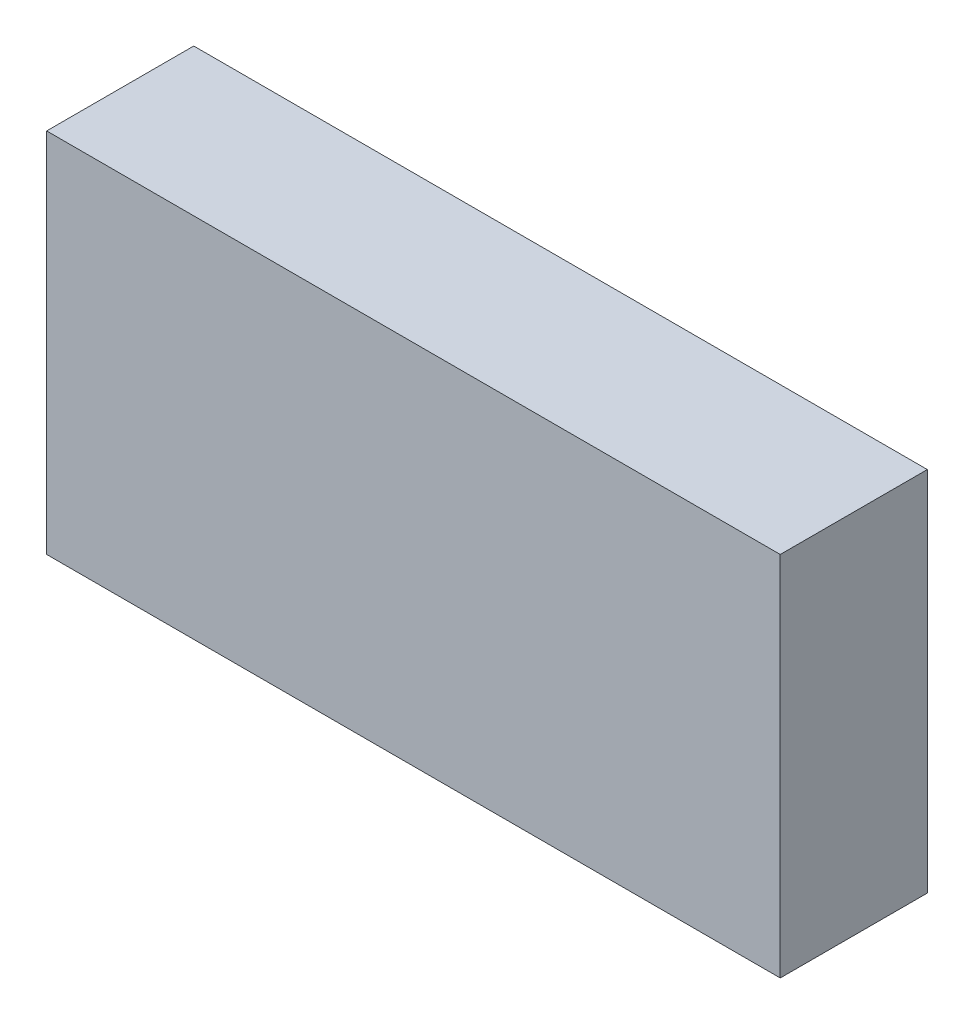
ISO-10303-21;
HEADER;
FILE_DESCRIPTION(('STEP AP214'),'2;1');
FILE_NAME('part.step','',(''),(''),'','','');
FILE_SCHEMA(('AUTOMOTIVE_DESIGN { 1 0 10303 214 1 1 1 1 }'));
ENDSEC;
DATA;
#1=APPLICATION_CONTEXT('core data for automotive mechanical design processes');
#2=APPLICATION_PROTOCOL_DEFINITION('international standard','automotive_design',2000,#1);
#3=PRODUCT_CONTEXT('',#1,'mechanical');
#4=PRODUCT('Part','Part','',(#3));
#5=PRODUCT_RELATED_PRODUCT_CATEGORY('part','',(#4));
#6=PRODUCT_DEFINITION_FORMATION('','',#4);
#7=PRODUCT_DEFINITION_CONTEXT('part definition',#1,'design');
#8=PRODUCT_DEFINITION('design','',#6,#7);
#9=PRODUCT_DEFINITION_SHAPE('','',#8);
#10=(LENGTH_UNIT() NAMED_UNIT(*) SI_UNIT(.MILLI.,.METRE.));
#11=(NAMED_UNIT(*) PLANE_ANGLE_UNIT() SI_UNIT($,.RADIAN.));
#12=(NAMED_UNIT(*) SI_UNIT($,.STERADIAN.) SOLID_ANGLE_UNIT());
#13=UNCERTAINTY_MEASURE_WITH_UNIT(LENGTH_MEASURE(1.E-05),#10,'distance_accuracy_value','');
#14=(GEOMETRIC_REPRESENTATION_CONTEXT(3) GLOBAL_UNCERTAINTY_ASSIGNED_CONTEXT((#13)) GLOBAL_UNIT_ASSIGNED_CONTEXT((#10,
#11,#12)) REPRESENTATION_CONTEXT('',''));
#15=CARTESIAN_POINT('',(0.,0.,0.));
#16=DIRECTION('',(0.,0.,1.));
#17=DIRECTION('',(1.,0.,0.));
#18=AXIS2_PLACEMENT_3D('',#15,#16,#17);
#19=CARTESIAN_POINT('',(0.,50.038,0.));
#20=DIRECTION('',(1.,0.,0.));
#21=DIRECTION('',(0.,0.,-1.));
#22=AXIS2_PLACEMENT_3D('',#19,#20,#21);
#23=PLANE('',#22);
#24=DIRECTION('',(0.,0.,1.));
#25=VECTOR('',#24,1.);
#26=CARTESIAN_POINT('',(0.,0.,0.));
#27=LINE('',#26,#25);
#28=CARTESIAN_POINT('',(0.,0.,-20.066));
#29=VERTEX_POINT('',#28);
#30=CARTESIAN_POINT('',(0.,0.,0.));
#31=VERTEX_POINT('',#30);
#32=EDGE_CURVE('E107',#29,#31,#27,.T.);
#33=ORIENTED_EDGE('',*,*,#32,.T.);
#34=DIRECTION('',(0.,-1.,0.));
#35=VECTOR('',#34,1.);
#36=CARTESIAN_POINT('',(0.,50.038,0.));
#37=LINE('',#36,#35);
#38=CARTESIAN_POINT('',(0.,50.038,0.));
#39=VERTEX_POINT('',#38);
#40=EDGE_CURVE('E11',#39,#31,#37,.T.);
#41=ORIENTED_EDGE('',*,*,#40,.F.);
#42=DIRECTION('',(0.,0.,1.));
#43=VECTOR('',#42,1.);
#44=CARTESIAN_POINT('',(0.,50.038,0.));
#45=LINE('',#44,#43);
#46=CARTESIAN_POINT('',(0.,50.038,-20.066));
#47=VERTEX_POINT('',#46);
#48=EDGE_CURVE('E91',#47,#39,#45,.T.);
#49=ORIENTED_EDGE('',*,*,#48,.F.);
#50=DIRECTION('',(0.,-1.,0.));
#51=VECTOR('',#50,1.);
#52=CARTESIAN_POINT('',(0.,50.038,-20.066));
#53=LINE('',#52,#51);
#54=EDGE_CURVE('E103',#47,#29,#53,.T.);
#55=ORIENTED_EDGE('',*,*,#54,.T.);
#56=EDGE_LOOP('',(#33,#41,#49,#55));
#57=FACE_BOUND('',#56,.T.);
#58=ADVANCED_FACE('F39',(#57),#23,.F.);
#59=CARTESIAN_POINT('',(0.,50.038,0.));
#60=DIRECTION('',(0.,0.,-1.));
#61=DIRECTION('',(-1.,0.,0.));
#62=AXIS2_PLACEMENT_3D('',#59,#60,#61);
#63=PLANE('',#62);
#64=DIRECTION('',(1.,0.,0.));
#65=VECTOR('',#64,1.);
#66=CARTESIAN_POINT('',(0.,0.,0.));
#67=LINE('',#66,#65);
#68=CARTESIAN_POINT('',(100.076,0.,0.));
#69=VERTEX_POINT('',#68);
#70=EDGE_CURVE('E96',#31,#69,#67,.T.);
#71=ORIENTED_EDGE('',*,*,#70,.T.);
#72=DIRECTION('',(0.,-1.,0.));
#73=VECTOR('',#72,1.);
#74=CARTESIAN_POINT('',(100.076,50.038,0.));
#75=LINE('',#74,#73);
#76=CARTESIAN_POINT('',(100.076,50.038,0.));
#77=VERTEX_POINT('',#76);
#78=EDGE_CURVE('E48',#77,#69,#75,.T.);
#79=ORIENTED_EDGE('',*,*,#78,.F.);
#80=DIRECTION('',(1.,0.,0.));
#81=VECTOR('',#80,1.);
#82=CARTESIAN_POINT('',(0.,50.038,0.));
#83=LINE('',#82,#81);
#84=EDGE_CURVE('E86',#39,#77,#83,.T.);
#85=ORIENTED_EDGE('',*,*,#84,.F.);
#86=ORIENTED_EDGE('',*,*,#40,.T.);
#87=EDGE_LOOP('',(#71,#79,#85,#86));
#88=FACE_BOUND('',#87,.T.);
#89=ADVANCED_FACE('F95',(#88),#63,.F.);
#90=CARTESIAN_POINT('',(100.076,50.038,0.));
#91=DIRECTION('',(-1.,0.,0.));
#92=DIRECTION('',(0.,0.,1.));
#93=AXIS2_PLACEMENT_3D('',#90,#91,#92);
#94=PLANE('',#93);
#95=DIRECTION('',(0.,0.,-1.));
#96=VECTOR('',#95,1.);
#97=CARTESIAN_POINT('',(100.076,0.,0.));
#98=LINE('',#97,#96);
#99=CARTESIAN_POINT('',(100.076,0.,-20.066));
#100=VERTEX_POINT('',#99);
#101=EDGE_CURVE('E73',#69,#100,#98,.T.);
#102=ORIENTED_EDGE('',*,*,#101,.T.);
#103=DIRECTION('',(0.,-1.,0.));
#104=VECTOR('',#103,1.);
#105=CARTESIAN_POINT('',(100.076,50.038,-20.066));
#106=LINE('',#105,#104);
#107=CARTESIAN_POINT('',(100.076,50.038,-20.066));
#108=VERTEX_POINT('',#107);
#109=EDGE_CURVE('E98',#108,#100,#106,.T.);
#110=ORIENTED_EDGE('',*,*,#109,.F.);
#111=DIRECTION('',(0.,0.,-1.));
#112=VECTOR('',#111,1.);
#113=CARTESIAN_POINT('',(100.076,50.038,0.));
#114=LINE('',#113,#112);
#115=EDGE_CURVE('E89',#77,#108,#114,.T.);
#116=ORIENTED_EDGE('',*,*,#115,.F.);
#117=ORIENTED_EDGE('',*,*,#78,.T.);
#118=EDGE_LOOP('',(#102,#110,#116,#117));
#119=FACE_BOUND('',#118,.T.);
#120=ADVANCED_FACE('F99',(#119),#94,.F.);
#121=CARTESIAN_POINT('',(0.,50.038,-20.066));
#122=DIRECTION('',(0.,0.,1.));
#123=DIRECTION('',(1.,0.,0.));
#124=AXIS2_PLACEMENT_3D('',#121,#122,#123);
#125=PLANE('',#124);
#126=DIRECTION('',(-1.,0.,0.));
#127=VECTOR('',#126,1.);
#128=CARTESIAN_POINT('',(0.,0.,-20.066));
#129=LINE('',#128,#127);
#130=EDGE_CURVE('E79',#100,#29,#129,.T.);
#131=ORIENTED_EDGE('',*,*,#130,.T.);
#132=ORIENTED_EDGE('',*,*,#54,.F.);
#133=DIRECTION('',(-1.,0.,0.));
#134=VECTOR('',#133,1.);
#135=CARTESIAN_POINT('',(0.,50.038,-20.066));
#136=LINE('',#135,#134);
#137=EDGE_CURVE('E56',#108,#47,#136,.T.);
#138=ORIENTED_EDGE('',*,*,#137,.F.);
#139=ORIENTED_EDGE('',*,*,#109,.T.);
#140=EDGE_LOOP('',(#131,#132,#138,#139));
#141=FACE_BOUND('',#140,.T.);
#142=ADVANCED_FACE('F120',(#141),#125,.F.);
#143=CARTESIAN_POINT('',(0.,50.038,0.));
#144=DIRECTION('',(0.,-1.,0.));
#145=DIRECTION('',(0.,0.,-1.));
#146=AXIS2_PLACEMENT_3D('',#143,#144,#145);
#147=PLANE('',#146);
#148=ORIENTED_EDGE('',*,*,#48,.T.);
#149=ORIENTED_EDGE('',*,*,#84,.T.);
#150=ORIENTED_EDGE('',*,*,#115,.T.);
#151=ORIENTED_EDGE('',*,*,#137,.T.);
#152=EDGE_LOOP('',(#148,#149,#150,#151));
#153=FACE_BOUND('',#152,.T.);
#154=ADVANCED_FACE('F87',(#153),#147,.F.);
#155=CARTESIAN_POINT('',(0.,0.,0.));
#156=DIRECTION('',(0.,-1.,0.));
#157=DIRECTION('',(0.,0.,-1.));
#158=AXIS2_PLACEMENT_3D('',#155,#156,#157);
#159=PLANE('',#158);
#160=ORIENTED_EDGE('',*,*,#32,.F.);
#161=ORIENTED_EDGE('',*,*,#130,.F.);
#162=ORIENTED_EDGE('',*,*,#101,.F.);
#163=ORIENTED_EDGE('',*,*,#70,.F.);
#164=EDGE_LOOP('',(#160,#161,#162,#163));
#165=FACE_BOUND('',#164,.T.);
#166=ADVANCED_FACE('F123',(#165),#159,.T.);
#167=CLOSED_SHELL('',(#58,#89,#120,#142,#154,#166));
#168=MANIFOLD_SOLID_BREP('B2',#167);
#169=ADVANCED_BREP_SHAPE_REPRESENTATION('',(#18,#168),#14);
#170=SHAPE_DEFINITION_REPRESENTATION(#9,#169);
ENDSEC;
END-ISO-10303-21;
